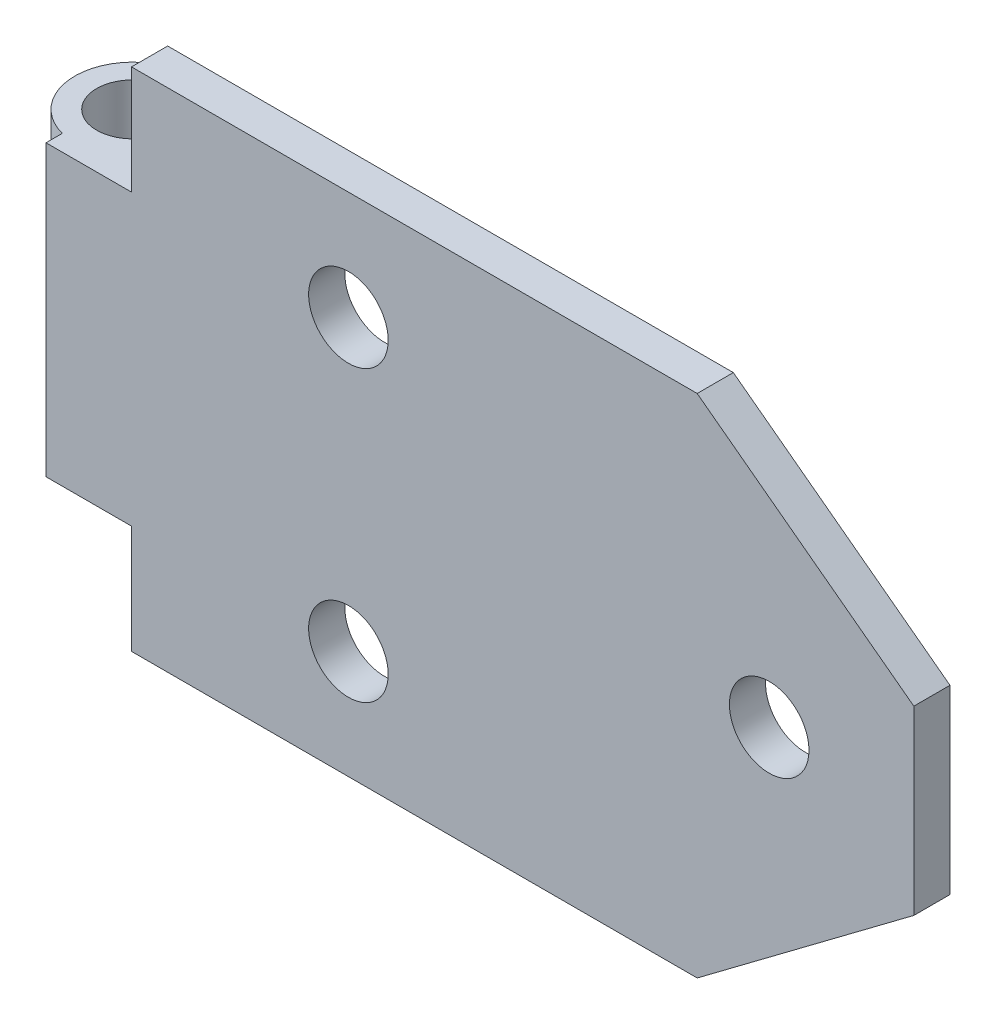
ISO-10303-21;
HEADER;
FILE_DESCRIPTION(('STEP AP214'),'2;1');
FILE_NAME('part.step','',(''),(''),'','','');
FILE_SCHEMA(('AUTOMOTIVE_DESIGN { 1 0 10303 214 1 1 1 1 }'));
ENDSEC;
DATA;
#1=APPLICATION_CONTEXT('core data for automotive mechanical design processes');
#2=APPLICATION_PROTOCOL_DEFINITION('international standard','automotive_design',2000,#1);
#3=PRODUCT_CONTEXT('',#1,'mechanical');
#4=PRODUCT('Part','Part','',(#3));
#5=PRODUCT_RELATED_PRODUCT_CATEGORY('part','',(#4));
#6=PRODUCT_DEFINITION_FORMATION('','',#4);
#7=PRODUCT_DEFINITION_CONTEXT('part definition',#1,'design');
#8=PRODUCT_DEFINITION('design','',#6,#7);
#9=PRODUCT_DEFINITION_SHAPE('','',#8);
#10=(LENGTH_UNIT() NAMED_UNIT(*) SI_UNIT(.MILLI.,.METRE.));
#11=(NAMED_UNIT(*) PLANE_ANGLE_UNIT() SI_UNIT($,.RADIAN.));
#12=(NAMED_UNIT(*) SI_UNIT($,.STERADIAN.) SOLID_ANGLE_UNIT());
#13=UNCERTAINTY_MEASURE_WITH_UNIT(LENGTH_MEASURE(1.E-05),#10,'distance_accuracy_value','');
#14=(GEOMETRIC_REPRESENTATION_CONTEXT(3) GLOBAL_UNCERTAINTY_ASSIGNED_CONTEXT((#13)) GLOBAL_UNIT_ASSIGNED_CONTEXT((#10,
#11,#12)) REPRESENTATION_CONTEXT('',''));
#15=CARTESIAN_POINT('',(0.,0.,0.));
#16=DIRECTION('',(0.,0.,1.));
#17=DIRECTION('',(1.,0.,0.));
#18=AXIS2_PLACEMENT_3D('',#15,#16,#17);
#19=CARTESIAN_POINT('',(0.,0.,0.));
#20=DIRECTION('',(0.,0.,1.));
#21=DIRECTION('',(1.,0.,0.));
#22=AXIS2_PLACEMENT_3D('',#19,#20,#21);
#23=PLANE('',#22);
#24=CARTESIAN_POINT('',(100.,35.,0.));
#25=DIRECTION('',(0.,0.,1.));
#26=DIRECTION('',(1.,0.,0.));
#27=AXIS2_PLACEMENT_3D('',#24,#25,#26);
#28=CIRCLE('',#27,5.50117827448801);
#29=CARTESIAN_POINT('',(105.501178274488,35.,0.));
#30=VERTEX_POINT('',#29);
#31=EDGE_CURVE('E233',#30,#30,#28,.T.);
#32=ORIENTED_EDGE('',*,*,#31,.T.);
#33=EDGE_LOOP('',(#32));
#34=FACE_BOUND('',#33,.T.);
#35=CARTESIAN_POINT('',(41.8149779691345,15.,0.));
#36=DIRECTION('',(0.,0.,1.));
#37=DIRECTION('',(1.,0.,0.));
#38=AXIS2_PLACEMENT_3D('',#35,#36,#37);
#39=CIRCLE('',#38,5.50117827448801);
#40=CARTESIAN_POINT('',(47.3161562436225,15.,0.));
#41=VERTEX_POINT('',#40);
#42=EDGE_CURVE('E238',#41,#41,#39,.T.);
#43=ORIENTED_EDGE('',*,*,#42,.T.);
#44=EDGE_LOOP('',(#43));
#45=FACE_BOUND('',#44,.T.);
#46=CARTESIAN_POINT('',(41.8149779691345,55.,0.));
#47=DIRECTION('',(0.,0.,1.));
#48=DIRECTION('',(1.,0.,0.));
#49=AXIS2_PLACEMENT_3D('',#46,#47,#48);
#50=CIRCLE('',#49,5.50117827448801);
#51=CARTESIAN_POINT('',(47.3161562436225,55.,0.));
#52=VERTEX_POINT('',#51);
#53=EDGE_CURVE('E246',#52,#52,#50,.T.);
#54=ORIENTED_EDGE('',*,*,#53,.T.);
#55=EDGE_LOOP('',(#54));
#56=FACE_BOUND('',#55,.T.);
#57=DIRECTION('',(0.,-1.,0.));
#58=VECTOR('',#57,1.);
#59=CARTESIAN_POINT('',(8.24499799839841,70.,0.));
#60=LINE('',#59,#58);
#61=CARTESIAN_POINT('',(8.24499799839841,55.,0.));
#62=VERTEX_POINT('',#61);
#63=CARTESIAN_POINT('',(8.24499799839841,15.,0.));
#64=VERTEX_POINT('',#63);
#65=EDGE_CURVE('E230',#62,#64,#60,.T.);
#66=ORIENTED_EDGE('',*,*,#65,.F.);
#67=DIRECTION('',(-1.,0.,0.));
#68=VECTOR('',#67,1.);
#69=CARTESIAN_POINT('',(11.823798536108,55.,0.));
#70=LINE('',#69,#68);
#71=CARTESIAN_POINT('',(11.823798536108,55.,0.));
#72=VERTEX_POINT('',#71);
#73=EDGE_CURVE('E178',#72,#62,#70,.T.);
#74=ORIENTED_EDGE('',*,*,#73,.F.);
#75=DIRECTION('',(0.,-1.,0.));
#76=VECTOR('',#75,1.);
#77=CARTESIAN_POINT('',(11.823798536108,55.,0.));
#78=LINE('',#77,#76);
#79=CARTESIAN_POINT('',(11.823798536108,70.,0.));
#80=VERTEX_POINT('',#79);
#81=EDGE_CURVE('E98',#80,#72,#78,.T.);
#82=ORIENTED_EDGE('',*,*,#81,.F.);
#83=DIRECTION('',(-1.,0.,0.));
#84=VECTOR('',#83,1.);
#85=CARTESIAN_POINT('',(11.823798536108,70.,0.));
#86=LINE('',#85,#84);
#87=CARTESIAN_POINT('',(90.0435705663087,70.,0.));
#88=VERTEX_POINT('',#87);
#89=EDGE_CURVE('E142',#88,#80,#86,.T.);
#90=ORIENTED_EDGE('',*,*,#89,.F.);
#91=DIRECTION('',(-0.799999999999999,0.6,0.));
#92=VECTOR('',#91,1.);
#93=CARTESIAN_POINT('',(90.0435705663087,70.,0.));
#94=LINE('',#93,#92);
#95=CARTESIAN_POINT('',(120.,47.5326779247315,0.));
#96=VERTEX_POINT('',#95);
#97=EDGE_CURVE('E171',#96,#88,#94,.T.);
#98=ORIENTED_EDGE('',*,*,#97,.F.);
#99=DIRECTION('',(0.,1.,0.));
#100=VECTOR('',#99,1.);
#101=CARTESIAN_POINT('',(120.,47.5326779247315,0.));
#102=LINE('',#101,#100);
#103=CARTESIAN_POINT('',(120.,22.4673220752685,0.));
#104=VERTEX_POINT('',#103);
#105=EDGE_CURVE('E168',#104,#96,#102,.T.);
#106=ORIENTED_EDGE('',*,*,#105,.F.);
#107=DIRECTION('',(0.8,0.6,0.));
#108=VECTOR('',#107,1.);
#109=CARTESIAN_POINT('',(120.,22.4673220752685,0.));
#110=LINE('',#109,#108);
#111=CARTESIAN_POINT('',(90.0435705663086,0.,0.));
#112=VERTEX_POINT('',#111);
#113=EDGE_CURVE('E165',#112,#104,#110,.T.);
#114=ORIENTED_EDGE('',*,*,#113,.F.);
#115=DIRECTION('',(1.,0.,0.));
#116=VECTOR('',#115,1.);
#117=CARTESIAN_POINT('',(90.0435705663086,0.,0.));
#118=LINE('',#117,#116);
#119=CARTESIAN_POINT('',(11.823798536108,0.,0.));
#120=VERTEX_POINT('',#119);
#121=EDGE_CURVE('E162',#120,#112,#118,.T.);
#122=ORIENTED_EDGE('',*,*,#121,.F.);
#123=DIRECTION('',(0.,-1.,0.));
#124=VECTOR('',#123,1.);
#125=CARTESIAN_POINT('',(11.823798536108,15.,0.));
#126=LINE('',#125,#124);
#127=CARTESIAN_POINT('',(11.823798536108,15.,0.));
#128=VERTEX_POINT('',#127);
#129=EDGE_CURVE('E158',#128,#120,#126,.T.);
#130=ORIENTED_EDGE('',*,*,#129,.F.);
#131=DIRECTION('',(1.,0.,0.));
#132=VECTOR('',#131,1.);
#133=CARTESIAN_POINT('',(0.,15.,0.));
#134=LINE('',#133,#132);
#135=EDGE_CURVE('E155',#64,#128,#134,.T.);
#136=ORIENTED_EDGE('',*,*,#135,.F.);
#137=EDGE_LOOP('',(#66,#74,#82,#90,#98,#106,#114,#122,#130,#136));
#138=FACE_BOUND('',#137,.T.);
#139=ADVANCED_FACE('F39',(#34,#45,#56,#138),#23,.F.);
#140=CARTESIAN_POINT('',(0.,55.,5.));
#141=DIRECTION('',(1.,0.,0.));
#142=DIRECTION('',(0.,0.,-1.));
#143=AXIS2_PLACEMENT_3D('',#140,#141,#142);
#144=PLANE('',#143);
#145=DIRECTION('',(0.,-1.,0.));
#146=VECTOR('',#145,1.);
#147=CARTESIAN_POINT('',(0.,70.,2.74596669241484));
#148=LINE('',#147,#146);
#149=CARTESIAN_POINT('',(0.,15.,2.74596669241484));
#150=VERTEX_POINT('',#149);
#151=CARTESIAN_POINT('',(0.,55.,2.74596669241484));
#152=VERTEX_POINT('',#151);
#153=EDGE_CURVE('E227',#150,#152,#148,.F.);
#154=ORIENTED_EDGE('',*,*,#153,.F.);
#155=DIRECTION('',(0.,0.,-1.));
#156=VECTOR('',#155,1.);
#157=CARTESIAN_POINT('',(0.,15.,5.));
#158=LINE('',#157,#156);
#159=CARTESIAN_POINT('',(0.,15.,5.));
#160=VERTEX_POINT('',#159);
#161=EDGE_CURVE('E11',#160,#150,#158,.T.);
#162=ORIENTED_EDGE('',*,*,#161,.F.);
#163=DIRECTION('',(0.,-1.,0.));
#164=VECTOR('',#163,1.);
#165=CARTESIAN_POINT('',(0.,55.,5.));
#166=LINE('',#165,#164);
#167=CARTESIAN_POINT('',(0.,55.,5.));
#168=VERTEX_POINT('',#167);
#169=EDGE_CURVE('E182',#168,#160,#166,.T.);
#170=ORIENTED_EDGE('',*,*,#169,.F.);
#171=DIRECTION('',(0.,0.,-1.));
#172=VECTOR('',#171,1.);
#173=CARTESIAN_POINT('',(0.,55.,5.));
#174=LINE('',#173,#172);
#175=EDGE_CURVE('E151',#168,#152,#174,.T.);
#176=ORIENTED_EDGE('',*,*,#175,.T.);
#177=EDGE_LOOP('',(#154,#162,#170,#176));
#178=FACE_BOUND('',#177,.T.);
#179=ADVANCED_FACE('F41',(#178),#144,.F.);
#180=CARTESIAN_POINT('',(0.,0.,5.));
#181=DIRECTION('',(0.,0.,1.));
#182=DIRECTION('',(1.,0.,0.));
#183=AXIS2_PLACEMENT_3D('',#180,#181,#182);
#184=PLANE('',#183);
#185=CARTESIAN_POINT('',(41.8149779691345,15.,5.));
#186=DIRECTION('',(0.,0.,1.));
#187=DIRECTION('',(1.,0.,0.));
#188=AXIS2_PLACEMENT_3D('',#185,#186,#187);
#189=CIRCLE('',#188,5.50117827448801);
#190=CARTESIAN_POINT('',(47.3161562436225,15.,5.));
#191=VERTEX_POINT('',#190);
#192=EDGE_CURVE('E242',#191,#191,#189,.T.);
#193=ORIENTED_EDGE('',*,*,#192,.F.);
#194=EDGE_LOOP('',(#193));
#195=FACE_BOUND('',#194,.T.);
#196=ORIENTED_EDGE('',*,*,#169,.T.);
#197=DIRECTION('',(1.,0.,0.));
#198=VECTOR('',#197,1.);
#199=CARTESIAN_POINT('',(0.,15.,5.));
#200=LINE('',#199,#198);
#201=CARTESIAN_POINT('',(11.823798536108,15.,5.));
#202=VERTEX_POINT('',#201);
#203=EDGE_CURVE('E105',#160,#202,#200,.T.);
#204=ORIENTED_EDGE('',*,*,#203,.T.);
#205=DIRECTION('',(0.,-1.,0.));
#206=VECTOR('',#205,1.);
#207=CARTESIAN_POINT('',(11.823798536108,15.,5.));
#208=LINE('',#207,#206);
#209=CARTESIAN_POINT('',(11.823798536108,0.,5.));
#210=VERTEX_POINT('',#209);
#211=EDGE_CURVE('E260',#202,#210,#208,.T.);
#212=ORIENTED_EDGE('',*,*,#211,.T.);
#213=DIRECTION('',(1.,0.,0.));
#214=VECTOR('',#213,1.);
#215=CARTESIAN_POINT('',(90.0435705663086,0.,5.));
#216=LINE('',#215,#214);
#217=CARTESIAN_POINT('',(90.0435705663086,0.,5.));
#218=VERTEX_POINT('',#217);
#219=EDGE_CURVE('E263',#210,#218,#216,.T.);
#220=ORIENTED_EDGE('',*,*,#219,.T.);
#221=DIRECTION('',(0.8,0.6,0.));
#222=VECTOR('',#221,1.);
#223=CARTESIAN_POINT('',(120.,22.4673220752685,5.));
#224=LINE('',#223,#222);
#225=CARTESIAN_POINT('',(120.,22.4673220752685,5.));
#226=VERTEX_POINT('',#225);
#227=EDGE_CURVE('E266',#218,#226,#224,.T.);
#228=ORIENTED_EDGE('',*,*,#227,.T.);
#229=DIRECTION('',(0.,1.,0.));
#230=VECTOR('',#229,1.);
#231=CARTESIAN_POINT('',(120.,47.5326779247315,5.));
#232=LINE('',#231,#230);
#233=CARTESIAN_POINT('',(120.,47.5326779247315,5.));
#234=VERTEX_POINT('',#233);
#235=EDGE_CURVE('E269',#226,#234,#232,.T.);
#236=ORIENTED_EDGE('',*,*,#235,.T.);
#237=DIRECTION('',(-0.799999999999999,0.6,0.));
#238=VECTOR('',#237,1.);
#239=CARTESIAN_POINT('',(90.0435705663087,70.,5.));
#240=LINE('',#239,#238);
#241=CARTESIAN_POINT('',(90.0435705663087,70.,5.));
#242=VERTEX_POINT('',#241);
#243=EDGE_CURVE('E133',#234,#242,#240,.T.);
#244=ORIENTED_EDGE('',*,*,#243,.T.);
#245=DIRECTION('',(-1.,0.,0.));
#246=VECTOR('',#245,1.);
#247=CARTESIAN_POINT('',(11.823798536108,70.,5.));
#248=LINE('',#247,#246);
#249=CARTESIAN_POINT('',(11.823798536108,70.,5.));
#250=VERTEX_POINT('',#249);
#251=EDGE_CURVE('E126',#242,#250,#248,.T.);
#252=ORIENTED_EDGE('',*,*,#251,.T.);
#253=DIRECTION('',(0.,-1.,0.));
#254=VECTOR('',#253,1.);
#255=CARTESIAN_POINT('',(11.823798536108,55.,5.));
#256=LINE('',#255,#254);
#257=CARTESIAN_POINT('',(11.823798536108,55.,5.));
#258=VERTEX_POINT('',#257);
#259=EDGE_CURVE('E131',#250,#258,#256,.T.);
#260=ORIENTED_EDGE('',*,*,#259,.T.);
#261=DIRECTION('',(-1.,0.,0.));
#262=VECTOR('',#261,1.);
#263=CARTESIAN_POINT('',(11.823798536108,55.,5.));
#264=LINE('',#263,#262);
#265=EDGE_CURVE('E65',#258,#168,#264,.T.);
#266=ORIENTED_EDGE('',*,*,#265,.T.);
#267=EDGE_LOOP('',(#196,#204,#212,#220,#228,#236,#244,#252,#260,#266));
#268=FACE_BOUND('',#267,.T.);
#269=CARTESIAN_POINT('',(41.8149779691345,55.,5.));
#270=DIRECTION('',(0.,0.,1.));
#271=DIRECTION('',(1.,0.,0.));
#272=AXIS2_PLACEMENT_3D('',#269,#270,#271);
#273=CIRCLE('',#272,5.50117827448801);
#274=CARTESIAN_POINT('',(47.3161562436225,55.,5.));
#275=VERTEX_POINT('',#274);
#276=EDGE_CURVE('E159',#275,#275,#273,.T.);
#277=ORIENTED_EDGE('',*,*,#276,.F.);
#278=EDGE_LOOP('',(#277));
#279=FACE_BOUND('',#278,.T.);
#280=CARTESIAN_POINT('',(100.,35.,5.));
#281=DIRECTION('',(0.,0.,1.));
#282=DIRECTION('',(1.,0.,0.));
#283=AXIS2_PLACEMENT_3D('',#280,#281,#282);
#284=CIRCLE('',#283,5.50117827448801);
#285=CARTESIAN_POINT('',(105.501178274488,35.,5.));
#286=VERTEX_POINT('',#285);
#287=EDGE_CURVE('E234',#286,#286,#284,.T.);
#288=ORIENTED_EDGE('',*,*,#287,.F.);
#289=EDGE_LOOP('',(#288));
#290=FACE_BOUND('',#289,.T.);
#291=ADVANCED_FACE('F128',(#195,#268,#279,#290),#184,.T.);
#292=CARTESIAN_POINT('',(0.,15.,5.));
#293=DIRECTION('',(0.,1.,0.));
#294=DIRECTION('',(0.,0.,1.));
#295=AXIS2_PLACEMENT_3D('',#292,#293,#294);
#296=PLANE('',#295);
#297=ORIENTED_EDGE('',*,*,#161,.T.);
#298=CARTESIAN_POINT('',(2.,15.,-5.));
#299=DIRECTION('',(0.,1.,0.));
#300=DIRECTION('',(0.,0.,1.));
#301=AXIS2_PLACEMENT_3D('',#298,#299,#300);
#302=CIRCLE('',#301,8.);
#303=EDGE_CURVE('E56',#64,#150,#302,.T.);
#304=ORIENTED_EDGE('',*,*,#303,.F.);
#305=ORIENTED_EDGE('',*,*,#135,.T.);
#306=DIRECTION('',(0.,0.,-1.));
#307=VECTOR('',#306,1.);
#308=CARTESIAN_POINT('',(11.823798536108,15.,5.));
#309=LINE('',#308,#307);
#310=EDGE_CURVE('E49',#202,#128,#309,.T.);
#311=ORIENTED_EDGE('',*,*,#310,.F.);
#312=ORIENTED_EDGE('',*,*,#203,.F.);
#313=EDGE_LOOP('',(#297,#304,#305,#311,#312));
#314=FACE_BOUND('',#313,.T.);
#315=CARTESIAN_POINT('',(2.,15.,-5.));
#316=DIRECTION('',(0.,1.,0.));
#317=DIRECTION('',(0.,0.,1.));
#318=AXIS2_PLACEMENT_3D('',#315,#316,#317);
#319=CIRCLE('',#318,5.);
#320=CARTESIAN_POINT('',(2.,15.,-10.));
#321=VERTEX_POINT('',#320);
#322=EDGE_CURVE('E208',#321,#321,#319,.T.);
#323=ORIENTED_EDGE('',*,*,#322,.T.);
#324=EDGE_LOOP('',(#323));
#325=FACE_BOUND('',#324,.T.);
#326=ADVANCED_FACE('F295',(#314,#325),#296,.F.);
#327=CARTESIAN_POINT('',(11.823798536108,15.,5.));
#328=DIRECTION('',(1.,0.,0.));
#329=DIRECTION('',(0.,1.,0.));
#330=AXIS2_PLACEMENT_3D('',#327,#328,#329);
#331=PLANE('',#330);
#332=ORIENTED_EDGE('',*,*,#129,.T.);
#333=DIRECTION('',(0.,0.,-1.));
#334=VECTOR('',#333,1.);
#335=CARTESIAN_POINT('',(11.823798536108,0.,5.));
#336=LINE('',#335,#334);
#337=EDGE_CURVE('E202',#210,#120,#336,.T.);
#338=ORIENTED_EDGE('',*,*,#337,.F.);
#339=ORIENTED_EDGE('',*,*,#211,.F.);
#340=ORIENTED_EDGE('',*,*,#310,.T.);
#341=EDGE_LOOP('',(#332,#338,#339,#340));
#342=FACE_BOUND('',#341,.T.);
#343=ADVANCED_FACE('F297',(#342),#331,.F.);
#344=CARTESIAN_POINT('',(90.0435705663086,0.,5.));
#345=DIRECTION('',(0.,1.,0.));
#346=DIRECTION('',(-1.,0.,0.));
#347=AXIS2_PLACEMENT_3D('',#344,#345,#346);
#348=PLANE('',#347);
#349=ORIENTED_EDGE('',*,*,#121,.T.);
#350=DIRECTION('',(0.,0.,-1.));
#351=VECTOR('',#350,1.);
#352=CARTESIAN_POINT('',(90.0435705663086,0.,5.));
#353=LINE('',#352,#351);
#354=EDGE_CURVE('E198',#218,#112,#353,.T.);
#355=ORIENTED_EDGE('',*,*,#354,.F.);
#356=ORIENTED_EDGE('',*,*,#219,.F.);
#357=ORIENTED_EDGE('',*,*,#337,.T.);
#358=EDGE_LOOP('',(#349,#355,#356,#357));
#359=FACE_BOUND('',#358,.T.);
#360=ADVANCED_FACE('F302',(#359),#348,.F.);
#361=CARTESIAN_POINT('',(120.,22.4673220752685,5.));
#362=DIRECTION('',(-0.6,0.8,0.));
#363=DIRECTION('',(-0.8,-0.6,0.));
#364=AXIS2_PLACEMENT_3D('',#361,#362,#363);
#365=PLANE('',#364);
#366=ORIENTED_EDGE('',*,*,#113,.T.);
#367=DIRECTION('',(0.,0.,-1.));
#368=VECTOR('',#367,1.);
#369=CARTESIAN_POINT('',(120.,22.4673220752685,5.));
#370=LINE('',#369,#368);
#371=EDGE_CURVE('E194',#226,#104,#370,.T.);
#372=ORIENTED_EDGE('',*,*,#371,.F.);
#373=ORIENTED_EDGE('',*,*,#227,.F.);
#374=ORIENTED_EDGE('',*,*,#354,.T.);
#375=EDGE_LOOP('',(#366,#372,#373,#374));
#376=FACE_BOUND('',#375,.T.);
#377=ADVANCED_FACE('F327',(#376),#365,.F.);
#378=CARTESIAN_POINT('',(120.,47.5326779247315,5.));
#379=DIRECTION('',(-1.,0.,0.));
#380=DIRECTION('',(0.,0.,1.));
#381=AXIS2_PLACEMENT_3D('',#378,#379,#380);
#382=PLANE('',#381);
#383=ORIENTED_EDGE('',*,*,#105,.T.);
#384=DIRECTION('',(0.,0.,-1.));
#385=VECTOR('',#384,1.);
#386=CARTESIAN_POINT('',(120.,47.5326779247315,5.));
#387=LINE('',#386,#385);
#388=EDGE_CURVE('E190',#234,#96,#387,.T.);
#389=ORIENTED_EDGE('',*,*,#388,.F.);
#390=ORIENTED_EDGE('',*,*,#235,.F.);
#391=ORIENTED_EDGE('',*,*,#371,.T.);
#392=EDGE_LOOP('',(#383,#389,#390,#391));
#393=FACE_BOUND('',#392,.T.);
#394=ADVANCED_FACE('F277',(#393),#382,.F.);
#395=CARTESIAN_POINT('',(90.0435705663087,70.,5.));
#396=DIRECTION('',(-0.600000000000001,-0.8,0.));
#397=DIRECTION('',(0.8,-0.600000000000001,0.));
#398=AXIS2_PLACEMENT_3D('',#395,#396,#397);
#399=PLANE('',#398);
#400=ORIENTED_EDGE('',*,*,#97,.T.);
#401=DIRECTION('',(0.,0.,-1.));
#402=VECTOR('',#401,1.);
#403=CARTESIAN_POINT('',(90.0435705663087,70.,5.));
#404=LINE('',#403,#402);
#405=EDGE_CURVE('E144',#242,#88,#404,.T.);
#406=ORIENTED_EDGE('',*,*,#405,.F.);
#407=ORIENTED_EDGE('',*,*,#243,.F.);
#408=ORIENTED_EDGE('',*,*,#388,.T.);
#409=EDGE_LOOP('',(#400,#406,#407,#408));
#410=FACE_BOUND('',#409,.T.);
#411=ADVANCED_FACE('F281',(#410),#399,.F.);
#412=CARTESIAN_POINT('',(11.823798536108,70.,5.));
#413=DIRECTION('',(0.,-1.,0.));
#414=DIRECTION('',(1.,0.,0.));
#415=AXIS2_PLACEMENT_3D('',#412,#413,#414);
#416=PLANE('',#415);
#417=ORIENTED_EDGE('',*,*,#89,.T.);
#418=DIRECTION('',(0.,0.,-1.));
#419=VECTOR('',#418,1.);
#420=CARTESIAN_POINT('',(11.823798536108,70.,5.));
#421=LINE('',#420,#419);
#422=EDGE_CURVE('E139',#250,#80,#421,.T.);
#423=ORIENTED_EDGE('',*,*,#422,.F.);
#424=ORIENTED_EDGE('',*,*,#251,.F.);
#425=ORIENTED_EDGE('',*,*,#405,.T.);
#426=EDGE_LOOP('',(#417,#423,#424,#425));
#427=FACE_BOUND('',#426,.T.);
#428=ADVANCED_FACE('F140',(#427),#416,.F.);
#429=CARTESIAN_POINT('',(11.823798536108,55.,5.));
#430=DIRECTION('',(1.,0.,0.));
#431=DIRECTION('',(0.,0.,-1.));
#432=AXIS2_PLACEMENT_3D('',#429,#430,#431);
#433=PLANE('',#432);
#434=ORIENTED_EDGE('',*,*,#81,.T.);
#435=DIRECTION('',(0.,0.,-1.));
#436=VECTOR('',#435,1.);
#437=CARTESIAN_POINT('',(11.823798536108,55.,5.));
#438=LINE('',#437,#436);
#439=EDGE_CURVE('E145',#258,#72,#438,.T.);
#440=ORIENTED_EDGE('',*,*,#439,.F.);
#441=ORIENTED_EDGE('',*,*,#259,.F.);
#442=ORIENTED_EDGE('',*,*,#422,.T.);
#443=EDGE_LOOP('',(#434,#440,#441,#442));
#444=FACE_BOUND('',#443,.T.);
#445=ADVANCED_FACE('F147',(#444),#433,.F.);
#446=CARTESIAN_POINT('',(11.823798536108,55.,5.));
#447=DIRECTION('',(0.,-1.,0.));
#448=DIRECTION('',(0.,0.,-1.));
#449=AXIS2_PLACEMENT_3D('',#446,#447,#448);
#450=PLANE('',#449);
#451=ORIENTED_EDGE('',*,*,#73,.T.);
#452=CARTESIAN_POINT('',(2.,55.,-5.));
#453=DIRECTION('',(0.,-1.,0.));
#454=DIRECTION('',(0.,0.,-1.));
#455=AXIS2_PLACEMENT_3D('',#452,#453,#454);
#456=CIRCLE('',#455,8.);
#457=EDGE_CURVE('E222',#152,#62,#456,.T.);
#458=ORIENTED_EDGE('',*,*,#457,.F.);
#459=ORIENTED_EDGE('',*,*,#175,.F.);
#460=ORIENTED_EDGE('',*,*,#265,.F.);
#461=ORIENTED_EDGE('',*,*,#439,.T.);
#462=EDGE_LOOP('',(#451,#458,#459,#460,#461));
#463=FACE_BOUND('',#462,.T.);
#464=CARTESIAN_POINT('',(2.,55.,-5.));
#465=DIRECTION('',(0.,-1.,0.));
#466=DIRECTION('',(0.,0.,-1.));
#467=AXIS2_PLACEMENT_3D('',#464,#465,#466);
#468=CIRCLE('',#467,5.);
#469=CARTESIAN_POINT('',(2.,55.,-10.));
#470=VERTEX_POINT('',#469);
#471=EDGE_CURVE('E43',#470,#470,#468,.T.);
#472=ORIENTED_EDGE('',*,*,#471,.T.);
#473=EDGE_LOOP('',(#472));
#474=FACE_BOUND('',#473,.T.);
#475=ADVANCED_FACE('F287',(#463,#474),#450,.F.);
#476=CARTESIAN_POINT('',(41.8149779691345,55.,5.));
#477=DIRECTION('',(0.,0.,-1.));
#478=DIRECTION('',(-1.,0.,0.));
#479=AXIS2_PLACEMENT_3D('',#476,#477,#478);
#480=CYLINDRICAL_SURFACE('',#479,5.50117827448801);
#481=ORIENTED_EDGE('',*,*,#276,.T.);
#482=EDGE_LOOP('',(#481));
#483=FACE_BOUND('',#482,.T.);
#484=ORIENTED_EDGE('',*,*,#53,.F.);
#485=EDGE_LOOP('',(#484));
#486=FACE_BOUND('',#485,.T.);
#487=ADVANCED_FACE('F318',(#483,#486),#480,.F.);
#488=CARTESIAN_POINT('',(41.8149779691345,15.,5.));
#489=DIRECTION('',(0.,0.,-1.));
#490=DIRECTION('',(-1.,0.,0.));
#491=AXIS2_PLACEMENT_3D('',#488,#489,#490);
#492=CYLINDRICAL_SURFACE('',#491,5.50117827448801);
#493=ORIENTED_EDGE('',*,*,#192,.T.);
#494=EDGE_LOOP('',(#493));
#495=FACE_BOUND('',#494,.T.);
#496=ORIENTED_EDGE('',*,*,#42,.F.);
#497=EDGE_LOOP('',(#496));
#498=FACE_BOUND('',#497,.T.);
#499=ADVANCED_FACE('F375',(#495,#498),#492,.F.);
#500=CARTESIAN_POINT('',(100.,35.,5.));
#501=DIRECTION('',(0.,0.,-1.));
#502=DIRECTION('',(-1.,0.,0.));
#503=AXIS2_PLACEMENT_3D('',#500,#501,#502);
#504=CYLINDRICAL_SURFACE('',#503,5.50117827448801);
#505=ORIENTED_EDGE('',*,*,#287,.T.);
#506=EDGE_LOOP('',(#505));
#507=FACE_BOUND('',#506,.T.);
#508=ORIENTED_EDGE('',*,*,#31,.F.);
#509=EDGE_LOOP('',(#508));
#510=FACE_BOUND('',#509,.T.);
#511=ADVANCED_FACE('F382',(#507,#510),#504,.F.);
#512=CARTESIAN_POINT('',(2.,70.,-5.));
#513=DIRECTION('',(0.,-1.,0.));
#514=DIRECTION('',(0.,0.,-1.));
#515=AXIS2_PLACEMENT_3D('',#512,#513,#514);
#516=CYLINDRICAL_SURFACE('',#515,8.);
#517=ORIENTED_EDGE('',*,*,#153,.T.);
#518=ORIENTED_EDGE('',*,*,#457,.T.);
#519=ORIENTED_EDGE('',*,*,#65,.T.);
#520=ORIENTED_EDGE('',*,*,#303,.T.);
#521=EDGE_LOOP('',(#517,#518,#519,#520));
#522=FACE_BOUND('',#521,.T.);
#523=ADVANCED_FACE('F291',(#522),#516,.T.);
#524=CARTESIAN_POINT('',(2.,70.,-5.));
#525=DIRECTION('',(0.,-1.,0.));
#526=DIRECTION('',(0.,0.,-1.));
#527=AXIS2_PLACEMENT_3D('',#524,#525,#526);
#528=CYLINDRICAL_SURFACE('',#527,5.);
#529=CARTESIAN_POINT('',(2.,55.,-10.));
#530=CARTESIAN_POINT('',(2.,54.5833333333333,-10.));
#531=CARTESIAN_POINT('',(2.,54.1666666666667,-10.));
#532=CARTESIAN_POINT('',(2.,53.3333333333333,-10.));
#533=CARTESIAN_POINT('',(2.,52.9166666666667,-10.));
#534=CARTESIAN_POINT('',(2.,52.0833333333333,-10.));
#535=CARTESIAN_POINT('',(2.,51.6666666666667,-10.));
#536=CARTESIAN_POINT('',(2.,50.8333333333333,-10.));
#537=CARTESIAN_POINT('',(2.,50.4166666666667,-10.));
#538=CARTESIAN_POINT('',(2.,49.5833333333333,-10.));
#539=CARTESIAN_POINT('',(2.,49.1666666666667,-10.));
#540=CARTESIAN_POINT('',(2.,48.3333333333333,-10.));
#541=CARTESIAN_POINT('',(2.,47.9166666666667,-10.));
#542=CARTESIAN_POINT('',(2.,47.0833333333333,-10.));
#543=CARTESIAN_POINT('',(2.,46.6666666666667,-10.));
#544=CARTESIAN_POINT('',(2.,45.8333333333333,-10.));
#545=CARTESIAN_POINT('',(2.,45.4166666666667,-10.));
#546=CARTESIAN_POINT('',(2.,44.5833333333333,-10.));
#547=CARTESIAN_POINT('',(2.,44.1666666666667,-10.));
#548=CARTESIAN_POINT('',(2.,43.3333333333333,-10.));
#549=CARTESIAN_POINT('',(2.,42.9166666666667,-10.));
#550=CARTESIAN_POINT('',(2.,42.0833333333333,-10.));
#551=CARTESIAN_POINT('',(2.,41.6666666666667,-10.));
#552=CARTESIAN_POINT('',(2.,40.8333333333333,-10.));
#553=CARTESIAN_POINT('',(2.,40.4166666666667,-10.));
#554=CARTESIAN_POINT('',(2.,39.5833333333333,-10.));
#555=CARTESIAN_POINT('',(2.,39.1666666666667,-10.));
#556=CARTESIAN_POINT('',(2.,38.3333333333333,-10.));
#557=CARTESIAN_POINT('',(2.,37.9166666666667,-10.));
#558=CARTESIAN_POINT('',(2.,37.0833333333333,-10.));
#559=CARTESIAN_POINT('',(2.,36.6666666666667,-10.));
#560=CARTESIAN_POINT('',(2.,35.8333333333333,-10.));
#561=CARTESIAN_POINT('',(2.,35.4166666666667,-10.));
#562=CARTESIAN_POINT('',(2.,34.5833333333333,-10.));
#563=CARTESIAN_POINT('',(2.,34.1666666666667,-10.));
#564=CARTESIAN_POINT('',(2.,33.3333333333333,-10.));
#565=CARTESIAN_POINT('',(2.,32.9166666666667,-10.));
#566=CARTESIAN_POINT('',(2.,32.0833333333333,-10.));
#567=CARTESIAN_POINT('',(2.,31.6666666666667,-10.));
#568=CARTESIAN_POINT('',(2.,30.8333333333333,-10.));
#569=CARTESIAN_POINT('',(2.,30.4166666666667,-10.));
#570=CARTESIAN_POINT('',(2.,29.5833333333333,-10.));
#571=CARTESIAN_POINT('',(2.,29.1666666666667,-10.));
#572=CARTESIAN_POINT('',(2.,28.3333333333333,-10.));
#573=CARTESIAN_POINT('',(2.,27.9166666666667,-10.));
#574=CARTESIAN_POINT('',(2.,27.0833333333333,-10.));
#575=CARTESIAN_POINT('',(2.,26.6666666666667,-10.));
#576=CARTESIAN_POINT('',(2.,25.8333333333333,-10.));
#577=CARTESIAN_POINT('',(2.,25.4166666666667,-10.));
#578=CARTESIAN_POINT('',(2.,24.5833333333333,-10.));
#579=CARTESIAN_POINT('',(2.,24.1666666666667,-10.));
#580=CARTESIAN_POINT('',(2.,23.3333333333333,-10.));
#581=CARTESIAN_POINT('',(2.,22.9166666666667,-10.));
#582=CARTESIAN_POINT('',(2.,22.0833333333333,-10.));
#583=CARTESIAN_POINT('',(2.,21.6666666666667,-10.));
#584=CARTESIAN_POINT('',(2.,20.8333333333333,-10.));
#585=CARTESIAN_POINT('',(2.,20.4166666666667,-10.));
#586=CARTESIAN_POINT('',(2.,19.5833333333333,-10.));
#587=CARTESIAN_POINT('',(2.,19.1666666666667,-10.));
#588=CARTESIAN_POINT('',(2.,18.3333333333333,-10.));
#589=CARTESIAN_POINT('',(2.,17.9166666666667,-10.));
#590=CARTESIAN_POINT('',(2.,17.0833333333333,-10.));
#591=CARTESIAN_POINT('',(2.,16.6666666666667,-10.));
#592=CARTESIAN_POINT('',(2.,15.8333333333333,-10.));
#593=CARTESIAN_POINT('',(2.,15.4166666666667,-10.));
#594=CARTESIAN_POINT('',(2.,15.,-10.));
#595=B_SPLINE_CURVE_WITH_KNOTS('',3,(#529,#530,#531,#532,#533,#534,#535,#536,#537,#538,#539,
#540,#541,#542,#543,#544,#545,#546,#547,#548,#549,#550,#551,#552,#553,#554,#555,#556,#557,#558,
#559,#560,#561,#562,#563,#564,#565,#566,#567,#568,#569,#570,#571,#572,#573,#574,#575,#576,#577,
#578,#579,#580,#581,#582,#583,#584,#585,#586,#587,#588,#589,#590,#591,#592,#593,#594),
.UNSPECIFIED.,.F.,.F.,(4,2,2,2,2,2,2,2,2,2,2,2,2,2,2,2,2,2,2,2,2,2,2,2,2,2,2,2,2,2,2,2,4),(0.,
1.25,2.5,3.75,5.,6.25,7.5,8.74999999999999,9.99999999999999,11.25,12.5,13.75,15.,16.25,17.5,
18.75,20.,21.25,22.5,23.75,25.,26.25,27.5,28.75,30.,31.25,32.5,33.75,35.,36.25,37.5,38.75,40.),.UNSPECIFIED.);
#596=EDGE_CURVE('BSEAM396',#470,#321,#595,.T.);
#597=ORIENTED_EDGE('',*,*,#471,.F.);
#598=ORIENTED_EDGE('',*,*,#322,.F.);
#599=ORIENTED_EDGE('',*,*,#596,.T.);
#600=ORIENTED_EDGE('',*,*,#596,.F.);
#601=EDGE_LOOP('',(#597,#599,#598,#600));
#602=FACE_BOUND('',#601,.T.);
#603=ADVANCED_FACE('F396',(#602),#528,.F.);
#604=CLOSED_SHELL('',(#139,#179,#291,#326,#343,#360,#377,#394,#411,#428,#445,#475,#487,#499,
#511,#523,#603));
#605=MANIFOLD_SOLID_BREP('B2',#604);
#606=ADVANCED_BREP_SHAPE_REPRESENTATION('',(#18,#605),#14);
#607=SHAPE_DEFINITION_REPRESENTATION(#9,#606);
ENDSEC;
END-ISO-10303-21;
